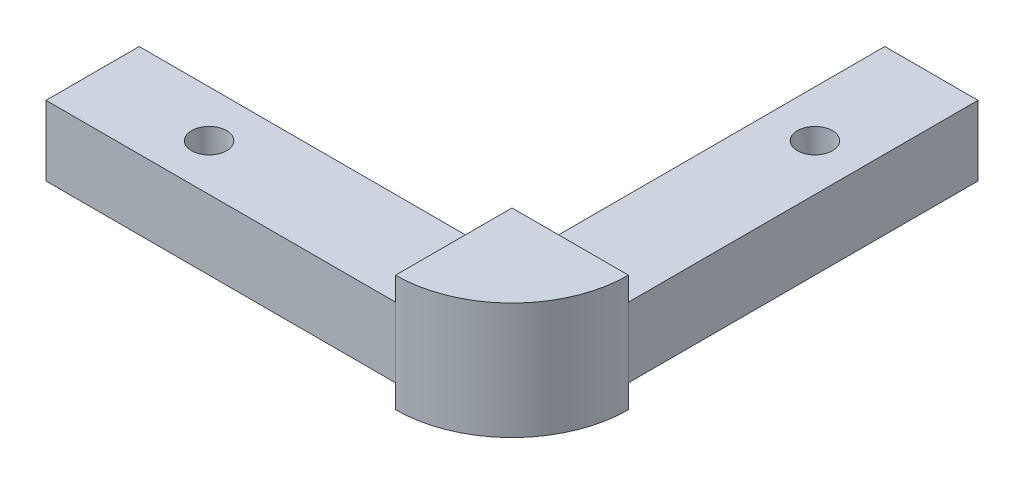
ISO-10303-21;
HEADER;
FILE_DESCRIPTION(('STEP AP214'),'2;1');
FILE_NAME('part.step','',(''),(''),'','','');
FILE_SCHEMA(('AUTOMOTIVE_DESIGN { 1 0 10303 214 1 1 1 1 }'));
ENDSEC;
DATA;
#1=APPLICATION_CONTEXT('core data for automotive mechanical design processes');
#2=APPLICATION_PROTOCOL_DEFINITION('international standard','automotive_design',2000,#1);
#3=PRODUCT_CONTEXT('',#1,'mechanical');
#4=PRODUCT('Part','Part','',(#3));
#5=PRODUCT_RELATED_PRODUCT_CATEGORY('part','',(#4));
#6=PRODUCT_DEFINITION_FORMATION('','',#4);
#7=PRODUCT_DEFINITION_CONTEXT('part definition',#1,'design');
#8=PRODUCT_DEFINITION('design','',#6,#7);
#9=PRODUCT_DEFINITION_SHAPE('','',#8);
#10=(LENGTH_UNIT() NAMED_UNIT(*) SI_UNIT(.MILLI.,.METRE.));
#11=(NAMED_UNIT(*) PLANE_ANGLE_UNIT() SI_UNIT($,.RADIAN.));
#12=(NAMED_UNIT(*) SI_UNIT($,.STERADIAN.) SOLID_ANGLE_UNIT());
#13=UNCERTAINTY_MEASURE_WITH_UNIT(LENGTH_MEASURE(1.E-05),#10,'distance_accuracy_value','');
#14=(GEOMETRIC_REPRESENTATION_CONTEXT(3) GLOBAL_UNCERTAINTY_ASSIGNED_CONTEXT((#13)) GLOBAL_UNIT_ASSIGNED_CONTEXT((#10,
#11,#12)) REPRESENTATION_CONTEXT('',''));
#15=CARTESIAN_POINT('',(0.,0.,0.));
#16=DIRECTION('',(0.,0.,1.));
#17=DIRECTION('',(1.,0.,0.));
#18=AXIS2_PLACEMENT_3D('',#15,#16,#17);
#19=CARTESIAN_POINT('',(-34.3342103379576,6.,-14.7736082004496));
#20=DIRECTION('',(0.,1.,0.));
#21=DIRECTION('',(0.,0.,1.));
#22=AXIS2_PLACEMENT_3D('',#19,#20,#21);
#23=PLANE('',#22);
#24=CARTESIAN_POINT('',(-54.3342103379576,6.,-8.77360820044956));
#25=DIRECTION('',(0.,1.,0.));
#26=DIRECTION('',(0.,0.,1.));
#27=AXIS2_PLACEMENT_3D('',#24,#25,#26);
#28=CIRCLE('',#27,1.5);
#29=CARTESIAN_POINT('',(-54.3342103379576,6.,-7.27360820044956));
#30=VERTEX_POINT('',#29);
#31=EDGE_CURVE('E187',#30,#30,#28,.T.);
#32=ORIENTED_EDGE('',*,*,#31,.F.);
#33=EDGE_LOOP('',(#32));
#34=FACE_BOUND('',#33,.T.);
#35=DIRECTION('',(0.,0.,1.));
#36=VECTOR('',#35,1.);
#37=CARTESIAN_POINT('',(-34.3342103379576,6.,-14.7736082004496));
#38=LINE('',#37,#36);
#39=CARTESIAN_POINT('',(-34.3342103379576,6.,-12.7736082004496));
#40=VERTEX_POINT('',#39);
#41=CARTESIAN_POINT('',(-34.3342103379576,6.,-4.77360820044956));
#42=VERTEX_POINT('',#41);
#43=EDGE_CURVE('E98',#40,#42,#38,.T.);
#44=ORIENTED_EDGE('',*,*,#43,.F.);
#45=DIRECTION('',(-1.,0.,0.));
#46=VECTOR('',#45,1.);
#47=CARTESIAN_POINT('',(-34.3342103379576,6.,-12.7736082004496));
#48=LINE('',#47,#46);
#49=CARTESIAN_POINT('',(-64.3342103379576,6.,-12.7736082004496));
#50=VERTEX_POINT('',#49);
#51=EDGE_CURVE('E154',#40,#50,#48,.T.);
#52=ORIENTED_EDGE('',*,*,#51,.T.);
#53=DIRECTION('',(0.,0.,1.));
#54=VECTOR('',#53,1.);
#55=CARTESIAN_POINT('',(-64.3342103379576,6.,-4.77360820044956));
#56=LINE('',#55,#54);
#57=CARTESIAN_POINT('',(-64.3342103379576,6.,-4.77360820044956));
#58=VERTEX_POINT('',#57);
#59=EDGE_CURVE('E241',#50,#58,#56,.T.);
#60=ORIENTED_EDGE('',*,*,#59,.T.);
#61=DIRECTION('',(1.,0.,0.));
#62=VECTOR('',#61,1.);
#63=CARTESIAN_POINT('',(-34.3342103379576,6.,-4.77360820044957));
#64=LINE('',#63,#62);
#65=EDGE_CURVE('E120',#58,#42,#64,.T.);
#66=ORIENTED_EDGE('',*,*,#65,.T.);
#67=EDGE_LOOP('',(#44,#52,#60,#66));
#68=FACE_BOUND('',#67,.T.);
#69=ADVANCED_FACE('F41',(#34,#68),#23,.T.);
#70=CARTESIAN_POINT('',(-34.3342103379576,0.,-14.7736082004496));
#71=DIRECTION('',(0.,1.,0.));
#72=DIRECTION('',(0.,0.,1.));
#73=AXIS2_PLACEMENT_3D('',#70,#71,#72);
#74=PLANE('',#73);
#75=CARTESIAN_POINT('',(-54.3342103379576,0.,-8.77360820044956));
#76=DIRECTION('',(0.,1.,0.));
#77=DIRECTION('',(0.,0.,1.));
#78=AXIS2_PLACEMENT_3D('',#75,#76,#77);
#79=CIRCLE('',#78,1.5);
#80=CARTESIAN_POINT('',(-54.3342103379576,0.,-7.27360820044956));
#81=VERTEX_POINT('',#80);
#82=EDGE_CURVE('E45',#81,#81,#79,.T.);
#83=ORIENTED_EDGE('',*,*,#82,.T.);
#84=EDGE_LOOP('',(#83));
#85=FACE_BOUND('',#84,.T.);
#86=DIRECTION('',(-1.,0.,0.));
#87=VECTOR('',#86,1.);
#88=CARTESIAN_POINT('',(-34.3342103379576,0.,-12.7736082004496));
#89=LINE('',#88,#87);
#90=CARTESIAN_POINT('',(-34.3342103379576,0.,-12.7736082004496));
#91=VERTEX_POINT('',#90);
#92=CARTESIAN_POINT('',(-64.3342103379576,0.,-12.7736082004496));
#93=VERTEX_POINT('',#92);
#94=EDGE_CURVE('E136',#91,#93,#89,.T.);
#95=ORIENTED_EDGE('',*,*,#94,.F.);
#96=DIRECTION('',(0.,0.,1.));
#97=VECTOR('',#96,1.);
#98=CARTESIAN_POINT('',(-34.3342103379576,0.,-14.7736082004496));
#99=LINE('',#98,#97);
#100=CARTESIAN_POINT('',(-34.3342103379576,0.,-4.77360820044957));
#101=VERTEX_POINT('',#100);
#102=EDGE_CURVE('E11',#91,#101,#99,.T.);
#103=ORIENTED_EDGE('',*,*,#102,.T.);
#104=DIRECTION('',(1.,0.,0.));
#105=VECTOR('',#104,1.);
#106=CARTESIAN_POINT('',(-34.3342103379576,0.,-4.77360820044957));
#107=LINE('',#106,#105);
#108=CARTESIAN_POINT('',(-64.3342103379576,0.,-4.77360820044956));
#109=VERTEX_POINT('',#108);
#110=EDGE_CURVE('E142',#109,#101,#107,.T.);
#111=ORIENTED_EDGE('',*,*,#110,.F.);
#112=DIRECTION('',(0.,0.,1.));
#113=VECTOR('',#112,1.);
#114=CARTESIAN_POINT('',(-64.3342103379576,0.,-4.77360820044956));
#115=LINE('',#114,#113);
#116=EDGE_CURVE('E139',#93,#109,#115,.T.);
#117=ORIENTED_EDGE('',*,*,#116,.F.);
#118=EDGE_LOOP('',(#95,#103,#111,#117));
#119=FACE_BOUND('',#118,.T.);
#120=ADVANCED_FACE('F297',(#85,#119),#74,.F.);
#121=CARTESIAN_POINT('',(-34.3342103379576,6.,-14.7736082004496));
#122=DIRECTION('',(1.,0.,0.));
#123=DIRECTION('',(0.,0.,-1.));
#124=AXIS2_PLACEMENT_3D('',#121,#122,#123);
#125=PLANE('',#124);
#126=DIRECTION('',(0.,-1.,0.));
#127=VECTOR('',#126,1.);
#128=CARTESIAN_POINT('',(-34.3342103379576,6.,-14.7736082004496));
#129=LINE('',#128,#127);
#130=CARTESIAN_POINT('',(-34.3342103379576,8.,-14.7736082004496));
#131=VERTEX_POINT('',#130);
#132=CARTESIAN_POINT('',(-34.3342103379576,-2.,-14.7736082004496));
#133=VERTEX_POINT('',#132);
#134=EDGE_CURVE('E132',#131,#133,#129,.T.);
#135=ORIENTED_EDGE('',*,*,#134,.T.);
#136=DIRECTION('',(0.,0.,1.));
#137=VECTOR('',#136,1.);
#138=CARTESIAN_POINT('',(-34.3342103379576,-2.,-14.7736082004496));
#139=LINE('',#138,#137);
#140=CARTESIAN_POINT('',(-34.3342103379576,-2.,-4.77360820044957));
#141=VERTEX_POINT('',#140);
#142=EDGE_CURVE('E214',#133,#141,#139,.T.);
#143=ORIENTED_EDGE('',*,*,#142,.T.);
#144=DIRECTION('',(0.,1.,0.));
#145=VECTOR('',#144,1.);
#146=CARTESIAN_POINT('',(-34.3342103379576,-2.,-4.77360820044957));
#147=LINE('',#146,#145);
#148=EDGE_CURVE('E231',#141,#101,#147,.T.);
#149=ORIENTED_EDGE('',*,*,#148,.T.);
#150=ORIENTED_EDGE('',*,*,#102,.F.);
#151=DIRECTION('',(0.,-1.,0.));
#152=VECTOR('',#151,1.);
#153=CARTESIAN_POINT('',(-34.3342103379576,6.,-12.7736082004496));
#154=LINE('',#153,#152);
#155=EDGE_CURVE('E178',#40,#91,#154,.T.);
#156=ORIENTED_EDGE('',*,*,#155,.F.);
#157=ORIENTED_EDGE('',*,*,#43,.T.);
#158=CARTESIAN_POINT('',(-34.3342103379576,8.,-4.77360820044957));
#159=VERTEX_POINT('',#158);
#160=EDGE_CURVE('E226',#42,#159,#147,.T.);
#161=ORIENTED_EDGE('',*,*,#160,.T.);
#162=DIRECTION('',(0.,0.,1.));
#163=VECTOR('',#162,1.);
#164=CARTESIAN_POINT('',(-34.3342103379576,8.,-14.7736082004496));
#165=LINE('',#164,#163);
#166=EDGE_CURVE('E193',#131,#159,#165,.T.);
#167=ORIENTED_EDGE('',*,*,#166,.F.);
#168=EDGE_LOOP('',(#135,#143,#149,#150,#156,#157,#161,#167));
#169=FACE_BOUND('',#168,.T.);
#170=ADVANCED_FACE('F43',(#169),#125,.F.);
#171=CARTESIAN_POINT('',(-34.3342103379576,6.,-12.7736082004496));
#172=DIRECTION('',(0.,0.,1.));
#173=DIRECTION('',(1.,0.,0.));
#174=AXIS2_PLACEMENT_3D('',#171,#172,#173);
#175=PLANE('',#174);
#176=ORIENTED_EDGE('',*,*,#94,.T.);
#177=DIRECTION('',(0.,-1.,0.));
#178=VECTOR('',#177,1.);
#179=CARTESIAN_POINT('',(-64.3342103379576,6.,-12.7736082004496));
#180=LINE('',#179,#178);
#181=EDGE_CURVE('E174',#50,#93,#180,.T.);
#182=ORIENTED_EDGE('',*,*,#181,.F.);
#183=ORIENTED_EDGE('',*,*,#51,.F.);
#184=ORIENTED_EDGE('',*,*,#155,.T.);
#185=EDGE_LOOP('',(#176,#182,#183,#184));
#186=FACE_BOUND('',#185,.T.);
#187=ADVANCED_FACE('F300',(#186),#175,.F.);
#188=CARTESIAN_POINT('',(-64.3342103379576,6.,-4.77360820044956));
#189=DIRECTION('',(1.,0.,0.));
#190=DIRECTION('',(0.,0.,-1.));
#191=AXIS2_PLACEMENT_3D('',#188,#189,#190);
#192=PLANE('',#191);
#193=ORIENTED_EDGE('',*,*,#116,.T.);
#194=DIRECTION('',(0.,-1.,0.));
#195=VECTOR('',#194,1.);
#196=CARTESIAN_POINT('',(-64.3342103379576,6.,-4.77360820044956));
#197=LINE('',#196,#195);
#198=EDGE_CURVE('E170',#58,#109,#197,.T.);
#199=ORIENTED_EDGE('',*,*,#198,.F.);
#200=ORIENTED_EDGE('',*,*,#59,.F.);
#201=ORIENTED_EDGE('',*,*,#181,.T.);
#202=EDGE_LOOP('',(#193,#199,#200,#201));
#203=FACE_BOUND('',#202,.T.);
#204=ADVANCED_FACE('F302',(#203),#192,.F.);
#205=CARTESIAN_POINT('',(-34.3342103379576,6.,-4.77360820044957));
#206=DIRECTION('',(0.,0.,-1.));
#207=DIRECTION('',(-1.,0.,0.));
#208=AXIS2_PLACEMENT_3D('',#205,#206,#207);
#209=PLANE('',#208);
#210=ORIENTED_EDGE('',*,*,#110,.T.);
#211=DIRECTION('',(0.,-1.,0.));
#212=VECTOR('',#211,1.);
#213=CARTESIAN_POINT('',(-34.3342103379576,6.,-4.77360820044956));
#214=LINE('',#213,#212);
#215=EDGE_CURVE('E166',#42,#101,#214,.T.);
#216=ORIENTED_EDGE('',*,*,#215,.F.);
#217=ORIENTED_EDGE('',*,*,#65,.F.);
#218=ORIENTED_EDGE('',*,*,#198,.T.);
#219=EDGE_LOOP('',(#210,#216,#217,#218));
#220=FACE_BOUND('',#219,.T.);
#221=ADVANCED_FACE('F249',(#220),#209,.F.);
#222=CARTESIAN_POINT('',(-34.3342103379576,6.,-14.7736082004496));
#223=DIRECTION('',(0.,-1.,0.));
#224=DIRECTION('',(0.,0.,-1.));
#225=AXIS2_PLACEMENT_3D('',#222,#223,#224);
#226=CYLINDRICAL_SURFACE('',#225,10.);
#227=ORIENTED_EDGE('',*,*,#215,.T.);
#228=ORIENTED_EDGE('',*,*,#148,.F.);
#229=CARTESIAN_POINT('',(-34.3342103379576,-2.,-14.7736082004496));
#230=DIRECTION('',(0.,1.,0.));
#231=DIRECTION('',(0.,0.,1.));
#232=AXIS2_PLACEMENT_3D('',#229,#230,#231);
#233=CIRCLE('',#232,10.);
#234=CARTESIAN_POINT('',(-24.3342103379576,-2.,-14.7736082004496));
#235=VERTEX_POINT('',#234);
#236=EDGE_CURVE('E218',#141,#235,#233,.T.);
#237=ORIENTED_EDGE('',*,*,#236,.T.);
#238=DIRECTION('',(0.,1.,0.));
#239=VECTOR('',#238,1.);
#240=CARTESIAN_POINT('',(-24.3342103379576,-2.,-14.7736082004496));
#241=LINE('',#240,#239);
#242=CARTESIAN_POINT('',(-24.3342103379576,0.,-14.7736082004496));
#243=VERTEX_POINT('',#242);
#244=EDGE_CURVE('E227',#235,#243,#241,.T.);
#245=ORIENTED_EDGE('',*,*,#244,.T.);
#246=DIRECTION('',(0.,-1.,0.));
#247=VECTOR('',#246,1.);
#248=CARTESIAN_POINT('',(-24.3342103379576,6.,-14.7736082004496));
#249=LINE('',#248,#247);
#250=CARTESIAN_POINT('',(-24.3342103379576,6.,-14.7736082004496));
#251=VERTEX_POINT('',#250);
#252=EDGE_CURVE('E125',#251,#243,#249,.T.);
#253=ORIENTED_EDGE('',*,*,#252,.F.);
#254=CARTESIAN_POINT('',(-24.3342103379576,8.,-14.7736082004496));
#255=VERTEX_POINT('',#254);
#256=EDGE_CURVE('E230',#251,#255,#241,.T.);
#257=ORIENTED_EDGE('',*,*,#256,.T.);
#258=CARTESIAN_POINT('',(-34.3342103379576,8.,-14.7736082004496));
#259=DIRECTION('',(0.,1.,0.));
#260=DIRECTION('',(0.,0.,1.));
#261=AXIS2_PLACEMENT_3D('',#258,#259,#260);
#262=CIRCLE('',#261,10.);
#263=EDGE_CURVE('E206',#159,#255,#262,.T.);
#264=ORIENTED_EDGE('',*,*,#263,.F.);
#265=ORIENTED_EDGE('',*,*,#160,.F.);
#266=EDGE_LOOP('',(#227,#228,#237,#245,#253,#257,#264,#265));
#267=FACE_BOUND('',#266,.T.);
#268=ADVANCED_FACE('F262',(#267),#226,.T.);
#269=CARTESIAN_POINT('',(-24.3342103379576,6.,-14.7736082004496));
#270=DIRECTION('',(-1.,0.,0.));
#271=DIRECTION('',(0.,0.,1.));
#272=AXIS2_PLACEMENT_3D('',#269,#270,#271);
#273=PLANE('',#272);
#274=DIRECTION('',(0.,0.,-1.));
#275=VECTOR('',#274,1.);
#276=CARTESIAN_POINT('',(-24.3342103379576,0.,-14.7736082004496));
#277=LINE('',#276,#275);
#278=CARTESIAN_POINT('',(-24.3342103379576,0.,-44.7736082004496));
#279=VERTEX_POINT('',#278);
#280=EDGE_CURVE('E82',#243,#279,#277,.T.);
#281=ORIENTED_EDGE('',*,*,#280,.T.);
#282=DIRECTION('',(0.,-1.,0.));
#283=VECTOR('',#282,1.);
#284=CARTESIAN_POINT('',(-24.3342103379576,6.,-44.7736082004496));
#285=LINE('',#284,#283);
#286=CARTESIAN_POINT('',(-24.3342103379576,6.,-44.7736082004496));
#287=VERTEX_POINT('',#286);
#288=EDGE_CURVE('E122',#287,#279,#285,.T.);
#289=ORIENTED_EDGE('',*,*,#288,.F.);
#290=DIRECTION('',(0.,0.,-1.));
#291=VECTOR('',#290,1.);
#292=CARTESIAN_POINT('',(-24.3342103379576,6.,-14.7736082004496));
#293=LINE('',#292,#291);
#294=EDGE_CURVE('E110',#251,#287,#293,.T.);
#295=ORIENTED_EDGE('',*,*,#294,.F.);
#296=ORIENTED_EDGE('',*,*,#252,.T.);
#297=EDGE_LOOP('',(#281,#289,#295,#296));
#298=FACE_BOUND('',#297,.T.);
#299=ADVANCED_FACE('F123',(#298),#273,.F.);
#300=CARTESIAN_POINT('',(-24.3342103379576,6.,-44.7736082004496));
#301=DIRECTION('',(0.,0.,1.));
#302=DIRECTION('',(1.,0.,0.));
#303=AXIS2_PLACEMENT_3D('',#300,#301,#302);
#304=PLANE('',#303);
#305=DIRECTION('',(-1.,0.,0.));
#306=VECTOR('',#305,1.);
#307=CARTESIAN_POINT('',(-24.3342103379576,0.,-44.7736082004496));
#308=LINE('',#307,#306);
#309=CARTESIAN_POINT('',(-32.3342103379576,0.,-44.7736082004496));
#310=VERTEX_POINT('',#309);
#311=EDGE_CURVE('E89',#279,#310,#308,.T.);
#312=ORIENTED_EDGE('',*,*,#311,.T.);
#313=DIRECTION('',(0.,-1.,0.));
#314=VECTOR('',#313,1.);
#315=CARTESIAN_POINT('',(-32.3342103379576,6.,-44.7736082004496));
#316=LINE('',#315,#314);
#317=CARTESIAN_POINT('',(-32.3342103379576,6.,-44.7736082004496));
#318=VERTEX_POINT('',#317);
#319=EDGE_CURVE('E126',#318,#310,#316,.T.);
#320=ORIENTED_EDGE('',*,*,#319,.F.);
#321=DIRECTION('',(-1.,0.,0.));
#322=VECTOR('',#321,1.);
#323=CARTESIAN_POINT('',(-24.3342103379576,6.,-44.7736082004496));
#324=LINE('',#323,#322);
#325=EDGE_CURVE('E113',#287,#318,#324,.T.);
#326=ORIENTED_EDGE('',*,*,#325,.F.);
#327=ORIENTED_EDGE('',*,*,#288,.T.);
#328=EDGE_LOOP('',(#312,#320,#326,#327));
#329=FACE_BOUND('',#328,.T.);
#330=ADVANCED_FACE('F128',(#329),#304,.F.);
#331=CARTESIAN_POINT('',(-32.3342103379576,6.,-14.7736082004496));
#332=DIRECTION('',(1.,0.,0.));
#333=DIRECTION('',(0.,0.,-1.));
#334=AXIS2_PLACEMENT_3D('',#331,#332,#333);
#335=PLANE('',#334);
#336=DIRECTION('',(0.,0.,1.));
#337=VECTOR('',#336,1.);
#338=CARTESIAN_POINT('',(-32.3342103379576,0.,-14.7736082004496));
#339=LINE('',#338,#337);
#340=CARTESIAN_POINT('',(-32.3342103379576,0.,-14.7736082004496));
#341=VERTEX_POINT('',#340);
#342=EDGE_CURVE('E150',#310,#341,#339,.T.);
#343=ORIENTED_EDGE('',*,*,#342,.T.);
#344=DIRECTION('',(0.,-1.,0.));
#345=VECTOR('',#344,1.);
#346=CARTESIAN_POINT('',(-32.3342103379576,6.,-14.7736082004496));
#347=LINE('',#346,#345);
#348=CARTESIAN_POINT('',(-32.3342103379576,6.,-14.7736082004496));
#349=VERTEX_POINT('',#348);
#350=EDGE_CURVE('E158',#349,#341,#347,.T.);
#351=ORIENTED_EDGE('',*,*,#350,.F.);
#352=DIRECTION('',(0.,0.,1.));
#353=VECTOR('',#352,1.);
#354=CARTESIAN_POINT('',(-32.3342103379576,6.,-14.7736082004496));
#355=LINE('',#354,#353);
#356=EDGE_CURVE('E61',#318,#349,#355,.T.);
#357=ORIENTED_EDGE('',*,*,#356,.F.);
#358=ORIENTED_EDGE('',*,*,#319,.T.);
#359=EDGE_LOOP('',(#343,#351,#357,#358));
#360=FACE_BOUND('',#359,.T.);
#361=ADVANCED_FACE('F326',(#360),#335,.F.);
#362=CARTESIAN_POINT('',(-34.3342103379576,6.,-14.7736082004496));
#363=DIRECTION('',(0.,0.,1.));
#364=DIRECTION('',(1.,0.,0.));
#365=AXIS2_PLACEMENT_3D('',#362,#363,#364);
#366=PLANE('',#365);
#367=ORIENTED_EDGE('',*,*,#350,.T.);
#368=DIRECTION('',(-1.,0.,0.));
#369=VECTOR('',#368,1.);
#370=CARTESIAN_POINT('',(-34.3342103379576,0.,-14.7736082004496));
#371=LINE('',#370,#369);
#372=EDGE_CURVE('E52',#243,#341,#371,.T.);
#373=ORIENTED_EDGE('',*,*,#372,.F.);
#374=ORIENTED_EDGE('',*,*,#244,.F.);
#375=DIRECTION('',(-1.,0.,0.));
#376=VECTOR('',#375,1.);
#377=CARTESIAN_POINT('',(-34.3342103379576,-2.,-14.7736082004496));
#378=LINE('',#377,#376);
#379=EDGE_CURVE('E222',#235,#133,#378,.T.);
#380=ORIENTED_EDGE('',*,*,#379,.T.);
#381=ORIENTED_EDGE('',*,*,#134,.F.);
#382=DIRECTION('',(-1.,0.,0.));
#383=VECTOR('',#382,1.);
#384=CARTESIAN_POINT('',(-34.3342103379576,8.,-14.7736082004496));
#385=LINE('',#384,#383);
#386=EDGE_CURVE('E210',#255,#131,#385,.T.);
#387=ORIENTED_EDGE('',*,*,#386,.F.);
#388=ORIENTED_EDGE('',*,*,#256,.F.);
#389=DIRECTION('',(-1.,0.,0.));
#390=VECTOR('',#389,1.);
#391=CARTESIAN_POINT('',(-34.3342103379576,6.,-14.7736082004496));
#392=LINE('',#391,#390);
#393=EDGE_CURVE('E116',#251,#349,#392,.T.);
#394=ORIENTED_EDGE('',*,*,#393,.T.);
#395=EDGE_LOOP('',(#367,#373,#374,#380,#381,#387,#388,#394));
#396=FACE_BOUND('',#395,.T.);
#397=ADVANCED_FACE('F274',(#396),#366,.F.);
#398=CARTESIAN_POINT('',(-28.3342103379576,6.,-34.7736082004496));
#399=DIRECTION('',(0.,1.,0.));
#400=DIRECTION('',(0.,0.,1.));
#401=AXIS2_PLACEMENT_3D('',#398,#399,#400);
#402=CIRCLE('',#401,1.5);
#403=CARTESIAN_POINT('',(-28.3342103379576,6.,-33.2736082004496));
#404=VERTEX_POINT('',#403);
#405=EDGE_CURVE('E195',#404,#404,#402,.T.);
#406=ORIENTED_EDGE('',*,*,#405,.F.);
#407=EDGE_LOOP('',(#406));
#408=FACE_BOUND('',#407,.T.);
#409=ORIENTED_EDGE('',*,*,#393,.F.);
#410=ORIENTED_EDGE('',*,*,#294,.T.);
#411=ORIENTED_EDGE('',*,*,#325,.T.);
#412=ORIENTED_EDGE('',*,*,#356,.T.);
#413=EDGE_LOOP('',(#409,#410,#411,#412));
#414=FACE_BOUND('',#413,.T.);
#415=ADVANCED_FACE('F111',(#408,#414),#23,.T.);
#416=CARTESIAN_POINT('',(-28.3342103379576,0.,-34.7736082004496));
#417=DIRECTION('',(0.,1.,0.));
#418=DIRECTION('',(0.,0.,1.));
#419=AXIS2_PLACEMENT_3D('',#416,#417,#418);
#420=CIRCLE('',#419,1.5);
#421=CARTESIAN_POINT('',(-28.3342103379576,0.,-33.2736082004496));
#422=VERTEX_POINT('',#421);
#423=EDGE_CURVE('E184',#422,#422,#420,.T.);
#424=ORIENTED_EDGE('',*,*,#423,.T.);
#425=EDGE_LOOP('',(#424));
#426=FACE_BOUND('',#425,.T.);
#427=ORIENTED_EDGE('',*,*,#280,.F.);
#428=ORIENTED_EDGE('',*,*,#372,.T.);
#429=ORIENTED_EDGE('',*,*,#342,.F.);
#430=ORIENTED_EDGE('',*,*,#311,.F.);
#431=EDGE_LOOP('',(#427,#428,#429,#430));
#432=FACE_BOUND('',#431,.T.);
#433=ADVANCED_FACE('F318',(#426,#432),#74,.F.);
#434=CARTESIAN_POINT('',(-34.3342103379576,-2.,-14.7736082004496));
#435=DIRECTION('',(0.,1.,0.));
#436=DIRECTION('',(0.,0.,1.));
#437=AXIS2_PLACEMENT_3D('',#434,#435,#436);
#438=PLANE('',#437);
#439=ORIENTED_EDGE('',*,*,#142,.F.);
#440=ORIENTED_EDGE('',*,*,#379,.F.);
#441=ORIENTED_EDGE('',*,*,#236,.F.);
#442=EDGE_LOOP('',(#439,#440,#441));
#443=FACE_BOUND('',#442,.T.);
#444=ADVANCED_FACE('F285',(#443),#438,.F.);
#445=CARTESIAN_POINT('',(-34.3342103379576,8.,-14.7736082004496));
#446=DIRECTION('',(0.,1.,0.));
#447=DIRECTION('',(0.,0.,1.));
#448=AXIS2_PLACEMENT_3D('',#445,#446,#447);
#449=PLANE('',#448);
#450=ORIENTED_EDGE('',*,*,#166,.T.);
#451=ORIENTED_EDGE('',*,*,#263,.T.);
#452=ORIENTED_EDGE('',*,*,#386,.T.);
#453=EDGE_LOOP('',(#450,#451,#452));
#454=FACE_BOUND('',#453,.T.);
#455=ADVANCED_FACE('F272',(#454),#449,.T.);
#456=CARTESIAN_POINT('',(-28.3342103379576,-4.,-34.7736082004496));
#457=DIRECTION('',(0.,1.,0.));
#458=DIRECTION('',(0.,0.,1.));
#459=AXIS2_PLACEMENT_3D('',#456,#457,#458);
#460=CYLINDRICAL_SURFACE('',#459,1.5);
#461=ORIENTED_EDGE('',*,*,#405,.T.);
#462=EDGE_LOOP('',(#461));
#463=FACE_BOUND('',#462,.T.);
#464=ORIENTED_EDGE('',*,*,#423,.F.);
#465=EDGE_LOOP('',(#464));
#466=FACE_BOUND('',#465,.T.);
#467=ADVANCED_FACE('F330',(#463,#466),#460,.F.);
#468=CARTESIAN_POINT('',(-54.3342103379576,-4.,-8.77360820044956));
#469=DIRECTION('',(0.,1.,0.));
#470=DIRECTION('',(0.,0.,1.));
#471=AXIS2_PLACEMENT_3D('',#468,#469,#470);
#472=CYLINDRICAL_SURFACE('',#471,1.5);
#473=ORIENTED_EDGE('',*,*,#31,.T.);
#474=EDGE_LOOP('',(#473));
#475=FACE_BOUND('',#474,.T.);
#476=ORIENTED_EDGE('',*,*,#82,.F.);
#477=EDGE_LOOP('',(#476));
#478=FACE_BOUND('',#477,.T.);
#479=ADVANCED_FACE('F333',(#475,#478),#472,.F.);
#480=CLOSED_SHELL('',(#69,#120,#170,#187,#204,#221,#268,#299,#330,#361,#397,#415,#433,#444,#455,
#467,#479));
#481=MANIFOLD_SOLID_BREP('B2',#480);
#482=ADVANCED_BREP_SHAPE_REPRESENTATION('',(#18,#481),#14);
#483=SHAPE_DEFINITION_REPRESENTATION(#9,#482);
ENDSEC;
END-ISO-10303-21;
